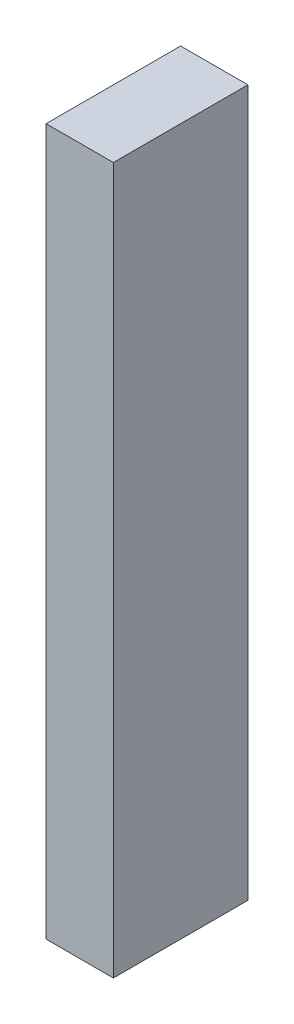
ISO-10303-21;
HEADER;
FILE_DESCRIPTION(('STEP AP214'),'2;1');
FILE_NAME('part.step','',(''),(''),'','','');
FILE_SCHEMA(('AUTOMOTIVE_DESIGN { 1 0 10303 214 1 1 1 1 }'));
ENDSEC;
DATA;
#1=APPLICATION_CONTEXT('core data for automotive mechanical design processes');
#2=APPLICATION_PROTOCOL_DEFINITION('international standard','automotive_design',2000,#1);
#3=PRODUCT_CONTEXT('',#1,'mechanical');
#4=PRODUCT('Part','Part','',(#3));
#5=PRODUCT_RELATED_PRODUCT_CATEGORY('part','',(#4));
#6=PRODUCT_DEFINITION_FORMATION('','',#4);
#7=PRODUCT_DEFINITION_CONTEXT('part definition',#1,'design');
#8=PRODUCT_DEFINITION('design','',#6,#7);
#9=PRODUCT_DEFINITION_SHAPE('','',#8);
#10=(LENGTH_UNIT() NAMED_UNIT(*) SI_UNIT(.MILLI.,.METRE.));
#11=(NAMED_UNIT(*) PLANE_ANGLE_UNIT() SI_UNIT($,.RADIAN.));
#12=(NAMED_UNIT(*) SI_UNIT($,.STERADIAN.) SOLID_ANGLE_UNIT());
#13=UNCERTAINTY_MEASURE_WITH_UNIT(LENGTH_MEASURE(1.E-05),#10,'distance_accuracy_value','');
#14=(GEOMETRIC_REPRESENTATION_CONTEXT(3) GLOBAL_UNCERTAINTY_ASSIGNED_CONTEXT((#13)) GLOBAL_UNIT_ASSIGNED_CONTEXT((#10,
#11,#12)) REPRESENTATION_CONTEXT('',''));
#15=CARTESIAN_POINT('',(0.,0.,0.));
#16=DIRECTION('',(0.,0.,1.));
#17=DIRECTION('',(1.,0.,0.));
#18=AXIS2_PLACEMENT_3D('',#15,#16,#17);
#19=CARTESIAN_POINT('',(0.,533.4,0.));
#20=DIRECTION('',(1.,0.,0.));
#21=DIRECTION('',(0.,0.,-1.));
#22=AXIS2_PLACEMENT_3D('',#19,#20,#21);
#23=PLANE('',#22);
#24=DIRECTION('',(0.,0.,1.));
#25=VECTOR('',#24,1.);
#26=CARTESIAN_POINT('',(0.,0.,0.));
#27=LINE('',#26,#25);
#28=CARTESIAN_POINT('',(0.,0.,-101.6));
#29=VERTEX_POINT('',#28);
#30=CARTESIAN_POINT('',(0.,0.,0.));
#31=VERTEX_POINT('',#30);
#32=EDGE_CURVE('E107',#29,#31,#27,.T.);
#33=ORIENTED_EDGE('',*,*,#32,.T.);
#34=DIRECTION('',(0.,-1.,0.));
#35=VECTOR('',#34,1.);
#36=CARTESIAN_POINT('',(0.,533.4,0.));
#37=LINE('',#36,#35);
#38=CARTESIAN_POINT('',(0.,533.4,0.));
#39=VERTEX_POINT('',#38);
#40=EDGE_CURVE('E11',#39,#31,#37,.T.);
#41=ORIENTED_EDGE('',*,*,#40,.F.);
#42=DIRECTION('',(0.,0.,1.));
#43=VECTOR('',#42,1.);
#44=CARTESIAN_POINT('',(0.,533.4,0.));
#45=LINE('',#44,#43);
#46=CARTESIAN_POINT('',(0.,533.4,-101.6));
#47=VERTEX_POINT('',#46);
#48=EDGE_CURVE('E91',#47,#39,#45,.T.);
#49=ORIENTED_EDGE('',*,*,#48,.F.);
#50=DIRECTION('',(0.,-1.,0.));
#51=VECTOR('',#50,1.);
#52=CARTESIAN_POINT('',(0.,533.4,-101.6));
#53=LINE('',#52,#51);
#54=EDGE_CURVE('E103',#47,#29,#53,.T.);
#55=ORIENTED_EDGE('',*,*,#54,.T.);
#56=EDGE_LOOP('',(#33,#41,#49,#55));
#57=FACE_BOUND('',#56,.T.);
#58=ADVANCED_FACE('F39',(#57),#23,.F.);
#59=CARTESIAN_POINT('',(0.,533.4,0.));
#60=DIRECTION('',(0.,0.,-1.));
#61=DIRECTION('',(-1.,0.,0.));
#62=AXIS2_PLACEMENT_3D('',#59,#60,#61);
#63=PLANE('',#62);
#64=DIRECTION('',(1.,0.,0.));
#65=VECTOR('',#64,1.);
#66=CARTESIAN_POINT('',(0.,0.,0.));
#67=LINE('',#66,#65);
#68=CARTESIAN_POINT('',(50.8,0.,0.));
#69=VERTEX_POINT('',#68);
#70=EDGE_CURVE('E96',#31,#69,#67,.T.);
#71=ORIENTED_EDGE('',*,*,#70,.T.);
#72=DIRECTION('',(0.,-1.,0.));
#73=VECTOR('',#72,1.);
#74=CARTESIAN_POINT('',(50.8,533.4,0.));
#75=LINE('',#74,#73);
#76=CARTESIAN_POINT('',(50.8,533.4,0.));
#77=VERTEX_POINT('',#76);
#78=EDGE_CURVE('E48',#77,#69,#75,.T.);
#79=ORIENTED_EDGE('',*,*,#78,.F.);
#80=DIRECTION('',(1.,0.,0.));
#81=VECTOR('',#80,1.);
#82=CARTESIAN_POINT('',(0.,533.4,0.));
#83=LINE('',#82,#81);
#84=EDGE_CURVE('E86',#39,#77,#83,.T.);
#85=ORIENTED_EDGE('',*,*,#84,.F.);
#86=ORIENTED_EDGE('',*,*,#40,.T.);
#87=EDGE_LOOP('',(#71,#79,#85,#86));
#88=FACE_BOUND('',#87,.T.);
#89=ADVANCED_FACE('F95',(#88),#63,.F.);
#90=CARTESIAN_POINT('',(50.8,533.4,0.));
#91=DIRECTION('',(-1.,0.,0.));
#92=DIRECTION('',(0.,0.,1.));
#93=AXIS2_PLACEMENT_3D('',#90,#91,#92);
#94=PLANE('',#93);
#95=DIRECTION('',(0.,0.,-1.));
#96=VECTOR('',#95,1.);
#97=CARTESIAN_POINT('',(50.8,0.,0.));
#98=LINE('',#97,#96);
#99=CARTESIAN_POINT('',(50.8,0.,-101.6));
#100=VERTEX_POINT('',#99);
#101=EDGE_CURVE('E73',#69,#100,#98,.T.);
#102=ORIENTED_EDGE('',*,*,#101,.T.);
#103=DIRECTION('',(0.,-1.,0.));
#104=VECTOR('',#103,1.);
#105=CARTESIAN_POINT('',(50.8,533.4,-101.6));
#106=LINE('',#105,#104);
#107=CARTESIAN_POINT('',(50.8,533.4,-101.6));
#108=VERTEX_POINT('',#107);
#109=EDGE_CURVE('E98',#108,#100,#106,.T.);
#110=ORIENTED_EDGE('',*,*,#109,.F.);
#111=DIRECTION('',(0.,0.,-1.));
#112=VECTOR('',#111,1.);
#113=CARTESIAN_POINT('',(50.8,533.4,0.));
#114=LINE('',#113,#112);
#115=EDGE_CURVE('E89',#77,#108,#114,.T.);
#116=ORIENTED_EDGE('',*,*,#115,.F.);
#117=ORIENTED_EDGE('',*,*,#78,.T.);
#118=EDGE_LOOP('',(#102,#110,#116,#117));
#119=FACE_BOUND('',#118,.T.);
#120=ADVANCED_FACE('F99',(#119),#94,.F.);
#121=CARTESIAN_POINT('',(0.,533.4,-101.6));
#122=DIRECTION('',(0.,0.,1.));
#123=DIRECTION('',(1.,0.,0.));
#124=AXIS2_PLACEMENT_3D('',#121,#122,#123);
#125=PLANE('',#124);
#126=DIRECTION('',(-1.,0.,0.));
#127=VECTOR('',#126,1.);
#128=CARTESIAN_POINT('',(0.,0.,-101.6));
#129=LINE('',#128,#127);
#130=EDGE_CURVE('E79',#100,#29,#129,.T.);
#131=ORIENTED_EDGE('',*,*,#130,.T.);
#132=ORIENTED_EDGE('',*,*,#54,.F.);
#133=DIRECTION('',(-1.,0.,0.));
#134=VECTOR('',#133,1.);
#135=CARTESIAN_POINT('',(0.,533.4,-101.6));
#136=LINE('',#135,#134);
#137=EDGE_CURVE('E56',#108,#47,#136,.T.);
#138=ORIENTED_EDGE('',*,*,#137,.F.);
#139=ORIENTED_EDGE('',*,*,#109,.T.);
#140=EDGE_LOOP('',(#131,#132,#138,#139));
#141=FACE_BOUND('',#140,.T.);
#142=ADVANCED_FACE('F120',(#141),#125,.F.);
#143=CARTESIAN_POINT('',(0.,533.4,0.));
#144=DIRECTION('',(0.,-1.,0.));
#145=DIRECTION('',(0.,0.,-1.));
#146=AXIS2_PLACEMENT_3D('',#143,#144,#145);
#147=PLANE('',#146);
#148=ORIENTED_EDGE('',*,*,#48,.T.);
#149=ORIENTED_EDGE('',*,*,#84,.T.);
#150=ORIENTED_EDGE('',*,*,#115,.T.);
#151=ORIENTED_EDGE('',*,*,#137,.T.);
#152=EDGE_LOOP('',(#148,#149,#150,#151));
#153=FACE_BOUND('',#152,.T.);
#154=ADVANCED_FACE('F87',(#153),#147,.F.);
#155=CARTESIAN_POINT('',(0.,0.,0.));
#156=DIRECTION('',(0.,-1.,0.));
#157=DIRECTION('',(0.,0.,-1.));
#158=AXIS2_PLACEMENT_3D('',#155,#156,#157);
#159=PLANE('',#158);
#160=ORIENTED_EDGE('',*,*,#32,.F.);
#161=ORIENTED_EDGE('',*,*,#130,.F.);
#162=ORIENTED_EDGE('',*,*,#101,.F.);
#163=ORIENTED_EDGE('',*,*,#70,.F.);
#164=EDGE_LOOP('',(#160,#161,#162,#163));
#165=FACE_BOUND('',#164,.T.);
#166=ADVANCED_FACE('F123',(#165),#159,.T.);
#167=CLOSED_SHELL('',(#58,#89,#120,#142,#154,#166));
#168=MANIFOLD_SOLID_BREP('B2',#167);
#169=ADVANCED_BREP_SHAPE_REPRESENTATION('',(#18,#168),#14);
#170=SHAPE_DEFINITION_REPRESENTATION(#9,#169);
ENDSEC;
END-ISO-10303-21;
